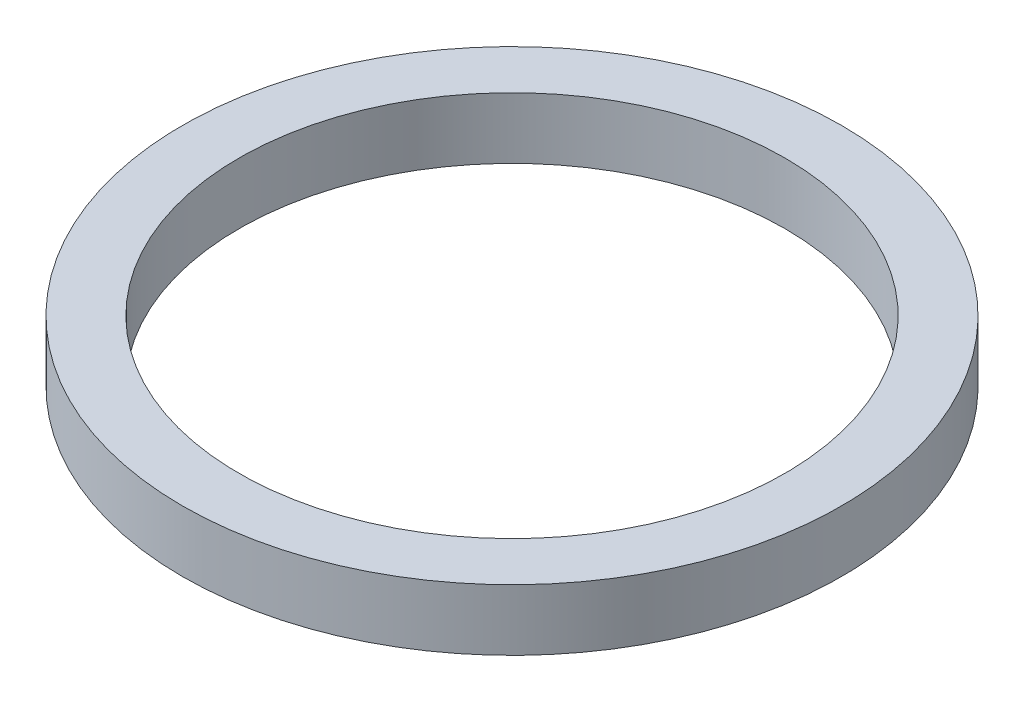
ISO-10303-21;
HEADER;
FILE_DESCRIPTION(('STEP AP214'),'2;1');
FILE_NAME('part.step','',(''),(''),'','','');
FILE_SCHEMA(('AUTOMOTIVE_DESIGN { 1 0 10303 214 1 1 1 1 }'));
ENDSEC;
DATA;
#1=APPLICATION_CONTEXT('core data for automotive mechanical design processes');
#2=APPLICATION_PROTOCOL_DEFINITION('international standard','automotive_design',2000,#1);
#3=PRODUCT_CONTEXT('',#1,'mechanical');
#4=PRODUCT('Part','Part','',(#3));
#5=PRODUCT_RELATED_PRODUCT_CATEGORY('part','',(#4));
#6=PRODUCT_DEFINITION_FORMATION('','',#4);
#7=PRODUCT_DEFINITION_CONTEXT('part definition',#1,'design');
#8=PRODUCT_DEFINITION('design','',#6,#7);
#9=PRODUCT_DEFINITION_SHAPE('','',#8);
#10=(LENGTH_UNIT() NAMED_UNIT(*) SI_UNIT(.MILLI.,.METRE.));
#11=(NAMED_UNIT(*) PLANE_ANGLE_UNIT() SI_UNIT($,.RADIAN.));
#12=(NAMED_UNIT(*) SI_UNIT($,.STERADIAN.) SOLID_ANGLE_UNIT());
#13=UNCERTAINTY_MEASURE_WITH_UNIT(LENGTH_MEASURE(1.E-05),#10,'distance_accuracy_value','');
#14=(GEOMETRIC_REPRESENTATION_CONTEXT(3) GLOBAL_UNCERTAINTY_ASSIGNED_CONTEXT((#13)) GLOBAL_UNIT_ASSIGNED_CONTEXT((#10,
#11,#12)) REPRESENTATION_CONTEXT('',''));
#15=CARTESIAN_POINT('',(0.,0.,0.));
#16=DIRECTION('',(0.,0.,1.));
#17=DIRECTION('',(1.,0.,0.));
#18=AXIS2_PLACEMENT_3D('',#15,#16,#17);
#19=CARTESIAN_POINT('',(0.,6.5,0.));
#20=DIRECTION('',(0.,1.,0.));
#21=DIRECTION('',(0.,0.,1.));
#22=AXIS2_PLACEMENT_3D('',#19,#20,#21);
#23=PLANE('',#22);
#24=CARTESIAN_POINT('',(0.,6.5,0.));
#25=DIRECTION('',(0.,1.,0.));
#26=DIRECTION('',(0.,0.,1.));
#27=AXIS2_PLACEMENT_3D('',#24,#25,#26);
#28=CIRCLE('',#27,35.);
#29=CARTESIAN_POINT('',(0.,6.5,-35.));
#30=VERTEX_POINT('',#29);
#31=EDGE_CURVE('E10',#30,#30,#28,.T.);
#32=ORIENTED_EDGE('',*,*,#31,.T.);
#33=EDGE_LOOP('',(#32));
#34=FACE_BOUND('',#33,.T.);
#35=CARTESIAN_POINT('',(0.,6.5,0.));
#36=DIRECTION('',(0.,1.,0.));
#37=DIRECTION('',(0.,0.,1.));
#38=AXIS2_PLACEMENT_3D('',#35,#36,#37);
#39=CIRCLE('',#38,29.);
#40=CARTESIAN_POINT('',(0.,6.5,-29.));
#41=VERTEX_POINT('',#40);
#42=EDGE_CURVE('E42',#41,#41,#39,.T.);
#43=ORIENTED_EDGE('',*,*,#42,.F.);
#44=EDGE_LOOP('',(#43));
#45=FACE_BOUND('',#44,.T.);
#46=ADVANCED_FACE('F31',(#34,#45),#23,.T.);
#47=CARTESIAN_POINT('',(0.,0.,0.));
#48=DIRECTION('',(0.,1.,0.));
#49=DIRECTION('',(0.,0.,1.));
#50=AXIS2_PLACEMENT_3D('',#47,#48,#49);
#51=PLANE('',#50);
#52=CARTESIAN_POINT('',(0.,0.,0.));
#53=DIRECTION('',(0.,1.,0.));
#54=DIRECTION('',(0.,0.,1.));
#55=AXIS2_PLACEMENT_3D('',#52,#53,#54);
#56=CIRCLE('',#55,35.);
#57=CARTESIAN_POINT('',(0.,0.,-35.));
#58=VERTEX_POINT('',#57);
#59=EDGE_CURVE('E35',#58,#58,#56,.T.);
#60=ORIENTED_EDGE('',*,*,#59,.F.);
#61=EDGE_LOOP('',(#60));
#62=FACE_BOUND('',#61,.T.);
#63=CARTESIAN_POINT('',(0.,0.,0.));
#64=DIRECTION('',(0.,1.,0.));
#65=DIRECTION('',(0.,0.,1.));
#66=AXIS2_PLACEMENT_3D('',#63,#64,#65);
#67=CIRCLE('',#66,29.);
#68=CARTESIAN_POINT('',(0.,0.,-29.));
#69=VERTEX_POINT('',#68);
#70=EDGE_CURVE('E44',#69,#69,#67,.T.);
#71=ORIENTED_EDGE('',*,*,#70,.T.);
#72=EDGE_LOOP('',(#71));
#73=FACE_BOUND('',#72,.T.);
#74=ADVANCED_FACE('F54',(#62,#73),#51,.F.);
#75=CARTESIAN_POINT('',(0.,6.5,0.));
#76=DIRECTION('',(0.,-1.,0.));
#77=DIRECTION('',(0.,0.,-1.));
#78=AXIS2_PLACEMENT_3D('',#75,#76,#77);
#79=CYLINDRICAL_SURFACE('',#78,35.);
#80=CARTESIAN_POINT('',(0.,6.5,-35.));
#81=CARTESIAN_POINT('',(0.,6.43229166666667,-35.));
#82=CARTESIAN_POINT('',(0.,6.36458333333333,-35.));
#83=CARTESIAN_POINT('',(0.,6.22916666666667,-35.));
#84=CARTESIAN_POINT('',(0.,6.16145833333333,-35.));
#85=CARTESIAN_POINT('',(0.,6.02604166666667,-35.));
#86=CARTESIAN_POINT('',(0.,5.95833333333333,-35.));
#87=CARTESIAN_POINT('',(0.,5.82291666666667,-35.));
#88=CARTESIAN_POINT('',(0.,5.75520833333333,-35.));
#89=CARTESIAN_POINT('',(0.,5.61979166666667,-35.));
#90=CARTESIAN_POINT('',(0.,5.55208333333333,-35.));
#91=CARTESIAN_POINT('',(0.,5.41666666666667,-35.));
#92=CARTESIAN_POINT('',(0.,5.34895833333333,-35.));
#93=CARTESIAN_POINT('',(0.,5.21354166666667,-35.));
#94=CARTESIAN_POINT('',(0.,5.14583333333333,-35.));
#95=CARTESIAN_POINT('',(0.,5.01041666666667,-35.));
#96=CARTESIAN_POINT('',(0.,4.94270833333333,-35.));
#97=CARTESIAN_POINT('',(0.,4.80729166666667,-35.));
#98=CARTESIAN_POINT('',(0.,4.73958333333333,-35.));
#99=CARTESIAN_POINT('',(0.,4.60416666666667,-35.));
#100=CARTESIAN_POINT('',(0.,4.53645833333333,-35.));
#101=CARTESIAN_POINT('',(0.,4.40104166666667,-35.));
#102=CARTESIAN_POINT('',(0.,4.33333333333333,-35.));
#103=CARTESIAN_POINT('',(0.,4.19791666666667,-35.));
#104=CARTESIAN_POINT('',(0.,4.13020833333333,-35.));
#105=CARTESIAN_POINT('',(0.,3.99479166666667,-35.));
#106=CARTESIAN_POINT('',(0.,3.92708333333333,-35.));
#107=CARTESIAN_POINT('',(0.,3.79166666666667,-35.));
#108=CARTESIAN_POINT('',(0.,3.72395833333333,-35.));
#109=CARTESIAN_POINT('',(0.,3.58854166666667,-35.));
#110=CARTESIAN_POINT('',(0.,3.52083333333333,-35.));
#111=CARTESIAN_POINT('',(0.,3.38541666666667,-35.));
#112=CARTESIAN_POINT('',(0.,3.31770833333333,-35.));
#113=CARTESIAN_POINT('',(0.,3.18229166666667,-35.));
#114=CARTESIAN_POINT('',(0.,3.11458333333333,-35.));
#115=CARTESIAN_POINT('',(0.,2.97916666666667,-35.));
#116=CARTESIAN_POINT('',(0.,2.91145833333333,-35.));
#117=CARTESIAN_POINT('',(0.,2.77604166666667,-35.));
#118=CARTESIAN_POINT('',(0.,2.70833333333333,-35.));
#119=CARTESIAN_POINT('',(0.,2.57291666666667,-35.));
#120=CARTESIAN_POINT('',(0.,2.50520833333333,-35.));
#121=CARTESIAN_POINT('',(0.,2.36979166666667,-35.));
#122=CARTESIAN_POINT('',(0.,2.30208333333333,-35.));
#123=CARTESIAN_POINT('',(0.,2.16666666666667,-35.));
#124=CARTESIAN_POINT('',(0.,2.09895833333333,-35.));
#125=CARTESIAN_POINT('',(0.,1.96354166666667,-35.));
#126=CARTESIAN_POINT('',(0.,1.89583333333333,-35.));
#127=CARTESIAN_POINT('',(0.,1.76041666666667,-35.));
#128=CARTESIAN_POINT('',(0.,1.69270833333333,-35.));
#129=CARTESIAN_POINT('',(0.,1.55729166666667,-35.));
#130=CARTESIAN_POINT('',(0.,1.48958333333333,-35.));
#131=CARTESIAN_POINT('',(0.,1.35416666666667,-35.));
#132=CARTESIAN_POINT('',(0.,1.28645833333333,-35.));
#133=CARTESIAN_POINT('',(0.,1.15104166666667,-35.));
#134=CARTESIAN_POINT('',(0.,1.08333333333333,-35.));
#135=CARTESIAN_POINT('',(0.,0.947916666666667,-35.));
#136=CARTESIAN_POINT('',(0.,0.880208333333333,-35.));
#137=CARTESIAN_POINT('',(0.,0.744791666666667,-35.));
#138=CARTESIAN_POINT('',(0.,0.677083333333333,-35.));
#139=CARTESIAN_POINT('',(0.,0.541666666666667,-35.));
#140=CARTESIAN_POINT('',(0.,0.473958333333333,-35.));
#141=CARTESIAN_POINT('',(0.,0.338541666666667,-35.));
#142=CARTESIAN_POINT('',(0.,0.270833333333334,-35.));
#143=CARTESIAN_POINT('',(0.,0.135416666666667,-35.));
#144=CARTESIAN_POINT('',(0.,0.0677083333333334,-35.));
#145=CARTESIAN_POINT('',(0.,0.,-35.));
#146=B_SPLINE_CURVE_WITH_KNOTS('',3,(#80,#81,#82,#83,#84,#85,#86,#87,#88,#89,#90,#91,#92,#93,
#94,#95,#96,#97,#98,#99,#100,#101,#102,#103,#104,#105,#106,#107,#108,#109,#110,#111,#112,#113,
#114,#115,#116,#117,#118,#119,#120,#121,#122,#123,#124,#125,#126,#127,#128,#129,#130,#131,#132,
#133,#134,#135,#136,#137,#138,#139,#140,#141,#142,#143,#144,#145),.UNSPECIFIED.,.F.,.F.,(4,2,2,
2,2,2,2,2,2,2,2,2,2,2,2,2,2,2,2,2,2,2,2,2,2,2,2,2,2,2,2,2,4),(0.,0.203124999999999,0.40625,
0.609375,0.812499999999999,1.015625,1.21875,1.421875,1.625,1.828125,2.03125,2.234375,2.4375,
2.640625,2.84375,3.046875,3.25,3.453125,3.65625,3.859375,4.0625,4.265625,4.46875,4.671875,4.875,
5.078125,5.28125,5.484375,5.6875,5.890625,6.09375,6.296875,6.5),.UNSPECIFIED.);
#147=EDGE_CURVE('BSEAM33',#30,#58,#146,.T.);
#148=ORIENTED_EDGE('',*,*,#31,.F.);
#149=ORIENTED_EDGE('',*,*,#59,.T.);
#150=ORIENTED_EDGE('',*,*,#147,.T.);
#151=ORIENTED_EDGE('',*,*,#147,.F.);
#152=EDGE_LOOP('',(#148,#150,#149,#151));
#153=FACE_BOUND('',#152,.T.);
#154=ADVANCED_FACE('F33',(#153),#79,.T.);
#155=CARTESIAN_POINT('',(0.,6.5,0.));
#156=DIRECTION('',(0.,-1.,0.));
#157=DIRECTION('',(0.,0.,-1.));
#158=AXIS2_PLACEMENT_3D('',#155,#156,#157);
#159=CYLINDRICAL_SURFACE('',#158,29.);
#160=CARTESIAN_POINT('',(0.,6.5,-29.));
#161=CARTESIAN_POINT('',(0.,6.43229166666667,-29.));
#162=CARTESIAN_POINT('',(0.,6.36458333333333,-29.));
#163=CARTESIAN_POINT('',(0.,6.22916666666667,-29.));
#164=CARTESIAN_POINT('',(0.,6.16145833333333,-29.));
#165=CARTESIAN_POINT('',(0.,6.02604166666667,-29.));
#166=CARTESIAN_POINT('',(0.,5.95833333333333,-29.));
#167=CARTESIAN_POINT('',(0.,5.82291666666667,-29.));
#168=CARTESIAN_POINT('',(0.,5.75520833333333,-29.));
#169=CARTESIAN_POINT('',(0.,5.61979166666667,-29.));
#170=CARTESIAN_POINT('',(0.,5.55208333333333,-29.));
#171=CARTESIAN_POINT('',(0.,5.41666666666667,-29.));
#172=CARTESIAN_POINT('',(0.,5.34895833333333,-29.));
#173=CARTESIAN_POINT('',(0.,5.21354166666667,-29.));
#174=CARTESIAN_POINT('',(0.,5.14583333333333,-29.));
#175=CARTESIAN_POINT('',(0.,5.01041666666667,-29.));
#176=CARTESIAN_POINT('',(0.,4.94270833333333,-29.));
#177=CARTESIAN_POINT('',(0.,4.80729166666667,-29.));
#178=CARTESIAN_POINT('',(0.,4.73958333333333,-29.));
#179=CARTESIAN_POINT('',(0.,4.60416666666667,-29.));
#180=CARTESIAN_POINT('',(0.,4.53645833333333,-29.));
#181=CARTESIAN_POINT('',(0.,4.40104166666667,-29.));
#182=CARTESIAN_POINT('',(0.,4.33333333333333,-29.));
#183=CARTESIAN_POINT('',(0.,4.19791666666667,-29.));
#184=CARTESIAN_POINT('',(0.,4.13020833333333,-29.));
#185=CARTESIAN_POINT('',(0.,3.99479166666667,-29.));
#186=CARTESIAN_POINT('',(0.,3.92708333333333,-29.));
#187=CARTESIAN_POINT('',(0.,3.79166666666667,-29.));
#188=CARTESIAN_POINT('',(0.,3.72395833333333,-29.));
#189=CARTESIAN_POINT('',(0.,3.58854166666667,-29.));
#190=CARTESIAN_POINT('',(0.,3.52083333333333,-29.));
#191=CARTESIAN_POINT('',(0.,3.38541666666667,-29.));
#192=CARTESIAN_POINT('',(0.,3.31770833333333,-29.));
#193=CARTESIAN_POINT('',(0.,3.18229166666667,-29.));
#194=CARTESIAN_POINT('',(0.,3.11458333333333,-29.));
#195=CARTESIAN_POINT('',(0.,2.97916666666667,-29.));
#196=CARTESIAN_POINT('',(0.,2.91145833333333,-29.));
#197=CARTESIAN_POINT('',(0.,2.77604166666667,-29.));
#198=CARTESIAN_POINT('',(0.,2.70833333333333,-29.));
#199=CARTESIAN_POINT('',(0.,2.57291666666667,-29.));
#200=CARTESIAN_POINT('',(0.,2.50520833333333,-29.));
#201=CARTESIAN_POINT('',(0.,2.36979166666667,-29.));
#202=CARTESIAN_POINT('',(0.,2.30208333333333,-29.));
#203=CARTESIAN_POINT('',(0.,2.16666666666667,-29.));
#204=CARTESIAN_POINT('',(0.,2.09895833333333,-29.));
#205=CARTESIAN_POINT('',(0.,1.96354166666667,-29.));
#206=CARTESIAN_POINT('',(0.,1.89583333333333,-29.));
#207=CARTESIAN_POINT('',(0.,1.76041666666667,-29.));
#208=CARTESIAN_POINT('',(0.,1.69270833333333,-29.));
#209=CARTESIAN_POINT('',(0.,1.55729166666667,-29.));
#210=CARTESIAN_POINT('',(0.,1.48958333333333,-29.));
#211=CARTESIAN_POINT('',(0.,1.35416666666667,-29.));
#212=CARTESIAN_POINT('',(0.,1.28645833333333,-29.));
#213=CARTESIAN_POINT('',(0.,1.15104166666667,-29.));
#214=CARTESIAN_POINT('',(0.,1.08333333333333,-29.));
#215=CARTESIAN_POINT('',(0.,0.947916666666667,-29.));
#216=CARTESIAN_POINT('',(0.,0.880208333333333,-29.));
#217=CARTESIAN_POINT('',(0.,0.744791666666667,-29.));
#218=CARTESIAN_POINT('',(0.,0.677083333333333,-29.));
#219=CARTESIAN_POINT('',(0.,0.541666666666667,-29.));
#220=CARTESIAN_POINT('',(0.,0.473958333333333,-29.));
#221=CARTESIAN_POINT('',(0.,0.338541666666667,-29.));
#222=CARTESIAN_POINT('',(0.,0.270833333333334,-29.));
#223=CARTESIAN_POINT('',(0.,0.135416666666667,-29.));
#224=CARTESIAN_POINT('',(0.,0.0677083333333334,-29.));
#225=CARTESIAN_POINT('',(0.,0.,-29.));
#226=B_SPLINE_CURVE_WITH_KNOTS('',3,(#160,#161,#162,#163,#164,#165,#166,#167,#168,#169,#170,
#171,#172,#173,#174,#175,#176,#177,#178,#179,#180,#181,#182,#183,#184,#185,#186,#187,#188,#189,
#190,#191,#192,#193,#194,#195,#196,#197,#198,#199,#200,#201,#202,#203,#204,#205,#206,#207,#208,
#209,#210,#211,#212,#213,#214,#215,#216,#217,#218,#219,#220,#221,#222,#223,#224,#225),
.UNSPECIFIED.,.F.,.F.,(4,2,2,2,2,2,2,2,2,2,2,2,2,2,2,2,2,2,2,2,2,2,2,2,2,2,2,2,2,2,2,2,4),(0.,
0.203125,0.40625,0.609375000000001,0.812500000000001,1.015625,1.21875,1.421875,1.625,1.828125,
2.03125,2.234375,2.4375,2.640625,2.84375,3.046875,3.25,3.453125,3.65625,3.859375,4.0625,
4.265625,4.46875,4.671875,4.875,5.078125,5.28125,5.484375,5.6875,5.890625,6.09375,6.296875,6.5),.UNSPECIFIED.);
#227=EDGE_CURVE('BSEAM50',#41,#69,#226,.T.);
#228=ORIENTED_EDGE('',*,*,#42,.T.);
#229=ORIENTED_EDGE('',*,*,#70,.F.);
#230=ORIENTED_EDGE('',*,*,#227,.T.);
#231=ORIENTED_EDGE('',*,*,#227,.F.);
#232=EDGE_LOOP('',(#228,#230,#229,#231));
#233=FACE_BOUND('',#232,.T.);
#234=ADVANCED_FACE('F50',(#233),#159,.F.);
#235=CLOSED_SHELL('',(#46,#74,#154,#234));
#236=MANIFOLD_SOLID_BREP('B2',#235);
#237=ADVANCED_BREP_SHAPE_REPRESENTATION('',(#18,#236),#14);
#238=SHAPE_DEFINITION_REPRESENTATION(#9,#237);
ENDSEC;
END-ISO-10303-21;
